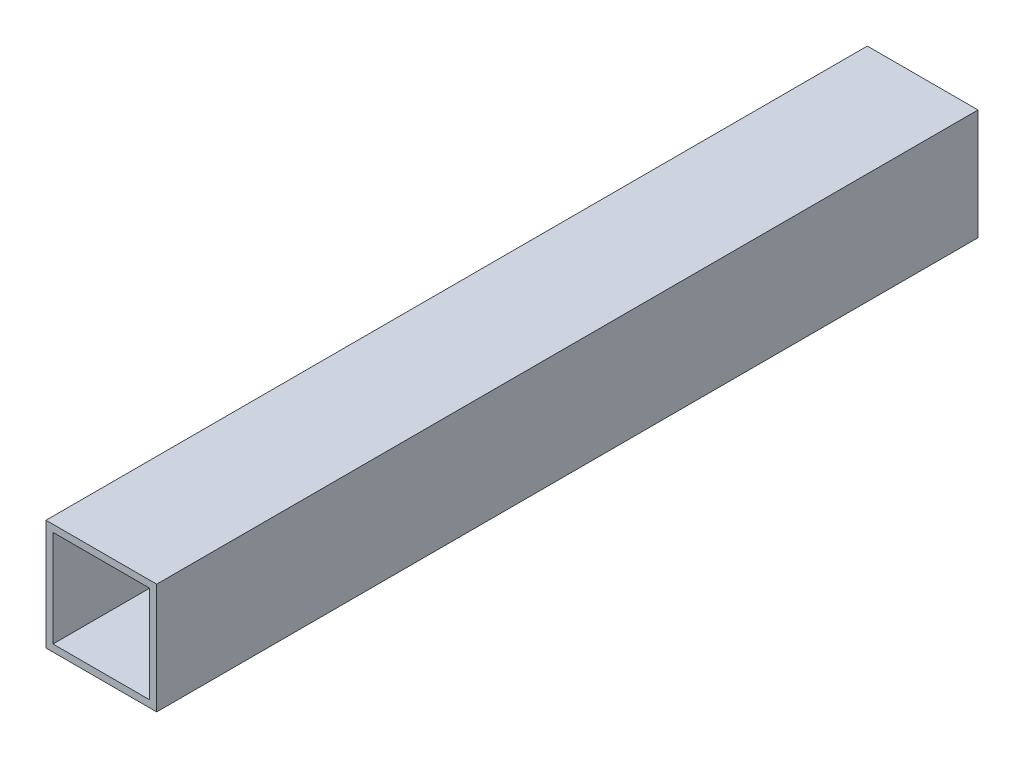
ISO-10303-21;
HEADER;
FILE_DESCRIPTION(('STEP AP214'),'2;1');
FILE_NAME('part.step','',(''),(''),'','','');
FILE_SCHEMA(('AUTOMOTIVE_DESIGN { 1 0 10303 214 1 1 1 1 }'));
ENDSEC;
DATA;
#1=APPLICATION_CONTEXT('core data for automotive mechanical design processes');
#2=APPLICATION_PROTOCOL_DEFINITION('international standard','automotive_design',2000,#1);
#3=PRODUCT_CONTEXT('',#1,'mechanical');
#4=PRODUCT('Part','Part','',(#3));
#5=PRODUCT_RELATED_PRODUCT_CATEGORY('part','',(#4));
#6=PRODUCT_DEFINITION_FORMATION('','',#4);
#7=PRODUCT_DEFINITION_CONTEXT('part definition',#1,'design');
#8=PRODUCT_DEFINITION('design','',#6,#7);
#9=PRODUCT_DEFINITION_SHAPE('','',#8);
#10=(LENGTH_UNIT() NAMED_UNIT(*) SI_UNIT(.MILLI.,.METRE.));
#11=(NAMED_UNIT(*) PLANE_ANGLE_UNIT() SI_UNIT($,.RADIAN.));
#12=(NAMED_UNIT(*) SI_UNIT($,.STERADIAN.) SOLID_ANGLE_UNIT());
#13=UNCERTAINTY_MEASURE_WITH_UNIT(LENGTH_MEASURE(1.E-05),#10,'distance_accuracy_value','');
#14=(GEOMETRIC_REPRESENTATION_CONTEXT(3) GLOBAL_UNCERTAINTY_ASSIGNED_CONTEXT((#13)) GLOBAL_UNIT_ASSIGNED_CONTEXT((#10,
#11,#12)) REPRESENTATION_CONTEXT('',''));
#15=CARTESIAN_POINT('',(0.,0.,0.));
#16=DIRECTION('',(0.,0.,1.));
#17=DIRECTION('',(1.,0.,0.));
#18=AXIS2_PLACEMENT_3D('',#15,#16,#17);
#19=CARTESIAN_POINT('',(0.,0.,70.5));
#20=DIRECTION('',(0.,0.,-1.));
#21=DIRECTION('',(-1.,0.,0.));
#22=AXIS2_PLACEMENT_3D('',#19,#20,#21);
#23=PLANE('',#22);
#24=DIRECTION('',(0.,-1.,0.));
#25=VECTOR('',#24,1.);
#26=CARTESIAN_POINT('',(-9.5,9.5,70.5));
#27=LINE('',#26,#25);
#28=CARTESIAN_POINT('',(-9.5,9.5,70.5));
#29=VERTEX_POINT('',#28);
#30=CARTESIAN_POINT('',(-9.5,-9.5,70.5));
#31=VERTEX_POINT('',#30);
#32=EDGE_CURVE('E138',#29,#31,#27,.T.);
#33=ORIENTED_EDGE('',*,*,#32,.T.);
#34=DIRECTION('',(1.,0.,0.));
#35=VECTOR('',#34,1.);
#36=CARTESIAN_POINT('',(9.5,-9.5,70.5));
#37=LINE('',#36,#35);
#38=CARTESIAN_POINT('',(9.5,-9.5,70.5));
#39=VERTEX_POINT('',#38);
#40=EDGE_CURVE('E141',#31,#39,#37,.T.);
#41=ORIENTED_EDGE('',*,*,#40,.T.);
#42=DIRECTION('',(0.,1.,0.));
#43=VECTOR('',#42,1.);
#44=CARTESIAN_POINT('',(9.5,9.5,70.5));
#45=LINE('',#44,#43);
#46=CARTESIAN_POINT('',(9.5,9.5,70.5));
#47=VERTEX_POINT('',#46);
#48=EDGE_CURVE('E144',#39,#47,#45,.T.);
#49=ORIENTED_EDGE('',*,*,#48,.T.);
#50=DIRECTION('',(-1.,0.,0.));
#51=VECTOR('',#50,1.);
#52=CARTESIAN_POINT('',(9.5,9.5,70.5));
#53=LINE('',#52,#51);
#54=EDGE_CURVE('E146',#47,#29,#53,.T.);
#55=ORIENTED_EDGE('',*,*,#54,.T.);
#56=EDGE_LOOP('',(#33,#41,#49,#55));
#57=FACE_BOUND('',#56,.T.);
#58=DIRECTION('',(-1.,0.,0.));
#59=VECTOR('',#58,1.);
#60=CARTESIAN_POINT('',(8.3,8.3,70.5));
#61=LINE('',#60,#59);
#62=CARTESIAN_POINT('',(8.3,8.3,70.5));
#63=VERTEX_POINT('',#62);
#64=CARTESIAN_POINT('',(-8.3,8.3,70.5));
#65=VERTEX_POINT('',#64);
#66=EDGE_CURVE('E102',#63,#65,#61,.T.);
#67=ORIENTED_EDGE('',*,*,#66,.F.);
#68=DIRECTION('',(0.,1.,0.));
#69=VECTOR('',#68,1.);
#70=CARTESIAN_POINT('',(8.3,8.3,70.5));
#71=LINE('',#70,#69);
#72=CARTESIAN_POINT('',(8.3,-8.3,70.5));
#73=VERTEX_POINT('',#72);
#74=EDGE_CURVE('E124',#73,#63,#71,.T.);
#75=ORIENTED_EDGE('',*,*,#74,.F.);
#76=DIRECTION('',(1.,0.,0.));
#77=VECTOR('',#76,1.);
#78=CARTESIAN_POINT('',(8.3,-8.3,70.5));
#79=LINE('',#78,#77);
#80=CARTESIAN_POINT('',(-8.3,-8.3,70.5));
#81=VERTEX_POINT('',#80);
#82=EDGE_CURVE('E122',#81,#73,#79,.T.);
#83=ORIENTED_EDGE('',*,*,#82,.F.);
#84=DIRECTION('',(0.,-1.,0.));
#85=VECTOR('',#84,1.);
#86=CARTESIAN_POINT('',(-8.3,8.3,70.5));
#87=LINE('',#86,#85);
#88=EDGE_CURVE('E110',#65,#81,#87,.T.);
#89=ORIENTED_EDGE('',*,*,#88,.F.);
#90=EDGE_LOOP('',(#67,#75,#83,#89));
#91=FACE_BOUND('',#90,.T.);
#92=ADVANCED_FACE('F37',(#57,#91),#23,.F.);
#93=CARTESIAN_POINT('',(0.,0.,-70.5));
#94=DIRECTION('',(0.,0.,-1.));
#95=DIRECTION('',(-1.,0.,0.));
#96=AXIS2_PLACEMENT_3D('',#93,#94,#95);
#97=PLANE('',#96);
#98=DIRECTION('',(0.,-1.,0.));
#99=VECTOR('',#98,1.);
#100=CARTESIAN_POINT('',(-9.5,9.5,-70.5));
#101=LINE('',#100,#99);
#102=CARTESIAN_POINT('',(-9.5,9.5,-70.5));
#103=VERTEX_POINT('',#102);
#104=CARTESIAN_POINT('',(-9.5,-9.5,-70.5));
#105=VERTEX_POINT('',#104);
#106=EDGE_CURVE('E118',#103,#105,#101,.T.);
#107=ORIENTED_EDGE('',*,*,#106,.F.);
#108=DIRECTION('',(-1.,0.,0.));
#109=VECTOR('',#108,1.);
#110=CARTESIAN_POINT('',(9.5,9.5,-70.5));
#111=LINE('',#110,#109);
#112=CARTESIAN_POINT('',(9.5,9.5,-70.5));
#113=VERTEX_POINT('',#112);
#114=EDGE_CURVE('E142',#113,#103,#111,.T.);
#115=ORIENTED_EDGE('',*,*,#114,.F.);
#116=DIRECTION('',(0.,1.,0.));
#117=VECTOR('',#116,1.);
#118=CARTESIAN_POINT('',(9.5,9.5,-70.5));
#119=LINE('',#118,#117);
#120=CARTESIAN_POINT('',(9.5,-9.5,-70.5));
#121=VERTEX_POINT('',#120);
#122=EDGE_CURVE('E153',#121,#113,#119,.T.);
#123=ORIENTED_EDGE('',*,*,#122,.F.);
#124=DIRECTION('',(1.,0.,0.));
#125=VECTOR('',#124,1.);
#126=CARTESIAN_POINT('',(9.5,-9.5,-70.5));
#127=LINE('',#126,#125);
#128=EDGE_CURVE('E151',#105,#121,#127,.T.);
#129=ORIENTED_EDGE('',*,*,#128,.F.);
#130=EDGE_LOOP('',(#107,#115,#123,#129));
#131=FACE_BOUND('',#130,.T.);
#132=DIRECTION('',(0.,1.,0.));
#133=VECTOR('',#132,1.);
#134=CARTESIAN_POINT('',(8.3,8.3,-70.5));
#135=LINE('',#134,#133);
#136=CARTESIAN_POINT('',(8.3,-8.3,-70.5));
#137=VERTEX_POINT('',#136);
#138=CARTESIAN_POINT('',(8.3,8.3,-70.5));
#139=VERTEX_POINT('',#138);
#140=EDGE_CURVE('E111',#137,#139,#135,.T.);
#141=ORIENTED_EDGE('',*,*,#140,.T.);
#142=DIRECTION('',(-1.,0.,0.));
#143=VECTOR('',#142,1.);
#144=CARTESIAN_POINT('',(8.3,8.3,-70.5));
#145=LINE('',#144,#143);
#146=CARTESIAN_POINT('',(-8.3,8.3,-70.5));
#147=VERTEX_POINT('',#146);
#148=EDGE_CURVE('E60',#139,#147,#145,.T.);
#149=ORIENTED_EDGE('',*,*,#148,.T.);
#150=DIRECTION('',(0.,-1.,0.));
#151=VECTOR('',#150,1.);
#152=CARTESIAN_POINT('',(-8.3,8.3,-70.5));
#153=LINE('',#152,#151);
#154=CARTESIAN_POINT('',(-8.3,-8.3,-70.5));
#155=VERTEX_POINT('',#154);
#156=EDGE_CURVE('E117',#147,#155,#153,.T.);
#157=ORIENTED_EDGE('',*,*,#156,.T.);
#158=DIRECTION('',(1.,0.,0.));
#159=VECTOR('',#158,1.);
#160=CARTESIAN_POINT('',(8.3,-8.3,-70.5));
#161=LINE('',#160,#159);
#162=EDGE_CURVE('E130',#155,#137,#161,.T.);
#163=ORIENTED_EDGE('',*,*,#162,.T.);
#164=EDGE_LOOP('',(#141,#149,#157,#163));
#165=FACE_BOUND('',#164,.T.);
#166=ADVANCED_FACE('F171',(#131,#165),#97,.T.);
#167=CARTESIAN_POINT('',(-9.5,9.5,70.5));
#168=DIRECTION('',(1.,0.,0.));
#169=DIRECTION('',(0.,1.,0.));
#170=AXIS2_PLACEMENT_3D('',#167,#168,#169);
#171=PLANE('',#170);
#172=ORIENTED_EDGE('',*,*,#106,.T.);
#173=DIRECTION('',(0.,0.,-1.));
#174=VECTOR('',#173,1.);
#175=CARTESIAN_POINT('',(-9.5,-9.5,70.5));
#176=LINE('',#175,#174);
#177=EDGE_CURVE('E11',#31,#105,#176,.T.);
#178=ORIENTED_EDGE('',*,*,#177,.F.);
#179=ORIENTED_EDGE('',*,*,#32,.F.);
#180=DIRECTION('',(0.,0.,-1.));
#181=VECTOR('',#180,1.);
#182=CARTESIAN_POINT('',(-9.5,9.5,70.5));
#183=LINE('',#182,#181);
#184=EDGE_CURVE('E148',#29,#103,#183,.T.);
#185=ORIENTED_EDGE('',*,*,#184,.T.);
#186=EDGE_LOOP('',(#172,#178,#179,#185));
#187=FACE_BOUND('',#186,.T.);
#188=ADVANCED_FACE('F39',(#187),#171,.F.);
#189=CARTESIAN_POINT('',(9.5,-9.5,70.5));
#190=DIRECTION('',(0.,1.,0.));
#191=DIRECTION('',(-1.,0.,0.));
#192=AXIS2_PLACEMENT_3D('',#189,#190,#191);
#193=PLANE('',#192);
#194=ORIENTED_EDGE('',*,*,#128,.T.);
#195=DIRECTION('',(0.,0.,-1.));
#196=VECTOR('',#195,1.);
#197=CARTESIAN_POINT('',(9.5,-9.5,70.5));
#198=LINE('',#197,#196);
#199=EDGE_CURVE('E45',#39,#121,#198,.T.);
#200=ORIENTED_EDGE('',*,*,#199,.F.);
#201=ORIENTED_EDGE('',*,*,#40,.F.);
#202=ORIENTED_EDGE('',*,*,#177,.T.);
#203=EDGE_LOOP('',(#194,#200,#201,#202));
#204=FACE_BOUND('',#203,.T.);
#205=ADVANCED_FACE('F181',(#204),#193,.F.);
#206=CARTESIAN_POINT('',(9.5,9.5,70.5));
#207=DIRECTION('',(-1.,0.,0.));
#208=DIRECTION('',(0.,-1.,0.));
#209=AXIS2_PLACEMENT_3D('',#206,#207,#208);
#210=PLANE('',#209);
#211=ORIENTED_EDGE('',*,*,#122,.T.);
#212=DIRECTION('',(0.,0.,-1.));
#213=VECTOR('',#212,1.);
#214=CARTESIAN_POINT('',(9.5,9.5,70.5));
#215=LINE('',#214,#213);
#216=EDGE_CURVE('E158',#47,#113,#215,.T.);
#217=ORIENTED_EDGE('',*,*,#216,.F.);
#218=ORIENTED_EDGE('',*,*,#48,.F.);
#219=ORIENTED_EDGE('',*,*,#199,.T.);
#220=EDGE_LOOP('',(#211,#217,#218,#219));
#221=FACE_BOUND('',#220,.T.);
#222=ADVANCED_FACE('F165',(#221),#210,.F.);
#223=CARTESIAN_POINT('',(9.5,9.5,70.5));
#224=DIRECTION('',(0.,-1.,0.));
#225=DIRECTION('',(1.,0.,0.));
#226=AXIS2_PLACEMENT_3D('',#223,#224,#225);
#227=PLANE('',#226);
#228=ORIENTED_EDGE('',*,*,#114,.T.);
#229=ORIENTED_EDGE('',*,*,#184,.F.);
#230=ORIENTED_EDGE('',*,*,#54,.F.);
#231=ORIENTED_EDGE('',*,*,#216,.T.);
#232=EDGE_LOOP('',(#228,#229,#230,#231));
#233=FACE_BOUND('',#232,.T.);
#234=ADVANCED_FACE('F175',(#233),#227,.F.);
#235=CARTESIAN_POINT('',(8.3,8.3,70.5));
#236=DIRECTION('',(0.,-1.,0.));
#237=DIRECTION('',(1.,0.,0.));
#238=AXIS2_PLACEMENT_3D('',#235,#236,#237);
#239=PLANE('',#238);
#240=ORIENTED_EDGE('',*,*,#148,.F.);
#241=DIRECTION('',(0.,0.,-1.));
#242=VECTOR('',#241,1.);
#243=CARTESIAN_POINT('',(8.3,8.3,70.5));
#244=LINE('',#243,#242);
#245=EDGE_CURVE('E106',#63,#139,#244,.T.);
#246=ORIENTED_EDGE('',*,*,#245,.F.);
#247=ORIENTED_EDGE('',*,*,#66,.T.);
#248=DIRECTION('',(0.,0.,-1.));
#249=VECTOR('',#248,1.);
#250=CARTESIAN_POINT('',(-8.3,8.3,70.5));
#251=LINE('',#250,#249);
#252=EDGE_CURVE('E105',#65,#147,#251,.T.);
#253=ORIENTED_EDGE('',*,*,#252,.T.);
#254=EDGE_LOOP('',(#240,#246,#247,#253));
#255=FACE_BOUND('',#254,.T.);
#256=ADVANCED_FACE('F104',(#255),#239,.T.);
#257=CARTESIAN_POINT('',(-8.3,8.3,70.5));
#258=DIRECTION('',(1.,0.,0.));
#259=DIRECTION('',(0.,1.,0.));
#260=AXIS2_PLACEMENT_3D('',#257,#258,#259);
#261=PLANE('',#260);
#262=ORIENTED_EDGE('',*,*,#156,.F.);
#263=ORIENTED_EDGE('',*,*,#252,.F.);
#264=ORIENTED_EDGE('',*,*,#88,.T.);
#265=DIRECTION('',(0.,0.,-1.));
#266=VECTOR('',#265,1.);
#267=CARTESIAN_POINT('',(-8.3,-8.3,70.5));
#268=LINE('',#267,#266);
#269=EDGE_CURVE('E119',#81,#155,#268,.T.);
#270=ORIENTED_EDGE('',*,*,#269,.T.);
#271=EDGE_LOOP('',(#262,#263,#264,#270));
#272=FACE_BOUND('',#271,.T.);
#273=ADVANCED_FACE('F114',(#272),#261,.T.);
#274=CARTESIAN_POINT('',(8.3,-8.3,70.5));
#275=DIRECTION('',(0.,1.,0.));
#276=DIRECTION('',(-1.,0.,0.));
#277=AXIS2_PLACEMENT_3D('',#274,#275,#276);
#278=PLANE('',#277);
#279=ORIENTED_EDGE('',*,*,#162,.F.);
#280=ORIENTED_EDGE('',*,*,#269,.F.);
#281=ORIENTED_EDGE('',*,*,#82,.T.);
#282=DIRECTION('',(0.,0.,-1.));
#283=VECTOR('',#282,1.);
#284=CARTESIAN_POINT('',(8.3,-8.3,70.5));
#285=LINE('',#284,#283);
#286=EDGE_CURVE('E52',#73,#137,#285,.T.);
#287=ORIENTED_EDGE('',*,*,#286,.T.);
#288=EDGE_LOOP('',(#279,#280,#281,#287));
#289=FACE_BOUND('',#288,.T.);
#290=ADVANCED_FACE('F204',(#289),#278,.T.);
#291=CARTESIAN_POINT('',(8.3,8.3,70.5));
#292=DIRECTION('',(-1.,0.,0.));
#293=DIRECTION('',(0.,-1.,0.));
#294=AXIS2_PLACEMENT_3D('',#291,#292,#293);
#295=PLANE('',#294);
#296=ORIENTED_EDGE('',*,*,#140,.F.);
#297=ORIENTED_EDGE('',*,*,#286,.F.);
#298=ORIENTED_EDGE('',*,*,#74,.T.);
#299=ORIENTED_EDGE('',*,*,#245,.T.);
#300=EDGE_LOOP('',(#296,#297,#298,#299));
#301=FACE_BOUND('',#300,.T.);
#302=ADVANCED_FACE('F208',(#301),#295,.T.);
#303=CLOSED_SHELL('',(#92,#166,#188,#205,#222,#234,#256,#273,#290,#302));
#304=MANIFOLD_SOLID_BREP('B2',#303);
#305=ADVANCED_BREP_SHAPE_REPRESENTATION('',(#18,#304),#14);
#306=SHAPE_DEFINITION_REPRESENTATION(#9,#305);
ENDSEC;
END-ISO-10303-21;
